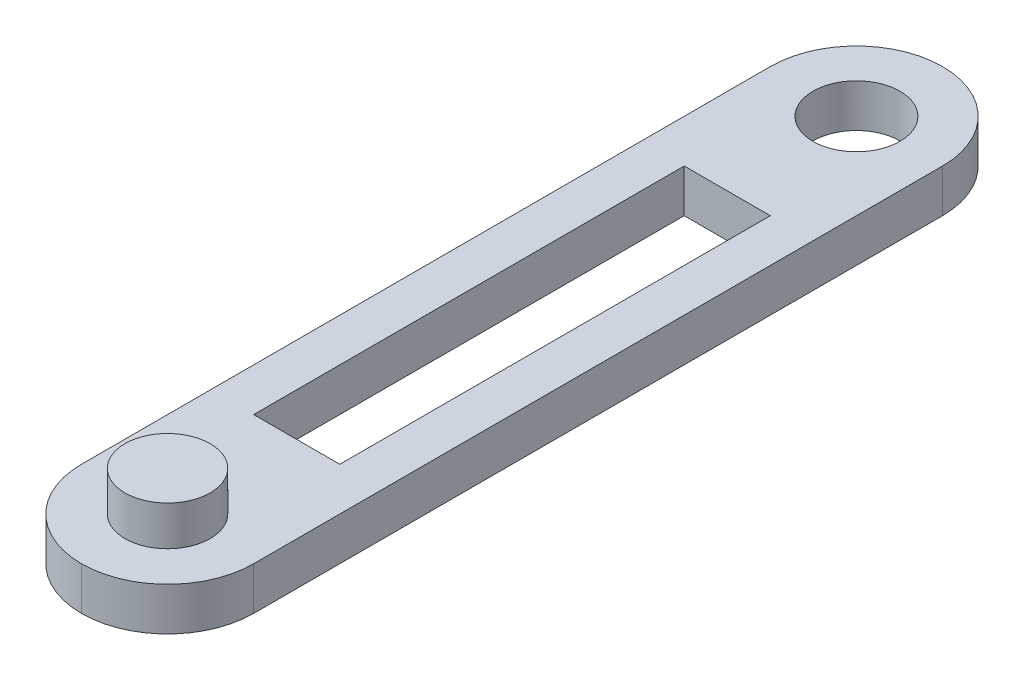
ISO-10303-21;
HEADER;
FILE_DESCRIPTION(('STEP AP214'),'2;1');
FILE_NAME('part.step','',(''),(''),'','','');
FILE_SCHEMA(('AUTOMOTIVE_DESIGN { 1 0 10303 214 1 1 1 1 }'));
ENDSEC;
DATA;
#1=APPLICATION_CONTEXT('core data for automotive mechanical design processes');
#2=APPLICATION_PROTOCOL_DEFINITION('international standard','automotive_design',2000,#1);
#3=PRODUCT_CONTEXT('',#1,'mechanical');
#4=PRODUCT('Part','Part','',(#3));
#5=PRODUCT_RELATED_PRODUCT_CATEGORY('part','',(#4));
#6=PRODUCT_DEFINITION_FORMATION('','',#4);
#7=PRODUCT_DEFINITION_CONTEXT('part definition',#1,'design');
#8=PRODUCT_DEFINITION('design','',#6,#7);
#9=PRODUCT_DEFINITION_SHAPE('','',#8);
#10=(LENGTH_UNIT() NAMED_UNIT(*) SI_UNIT(.MILLI.,.METRE.));
#11=(NAMED_UNIT(*) PLANE_ANGLE_UNIT() SI_UNIT($,.RADIAN.));
#12=(NAMED_UNIT(*) SI_UNIT($,.STERADIAN.) SOLID_ANGLE_UNIT());
#13=UNCERTAINTY_MEASURE_WITH_UNIT(LENGTH_MEASURE(1.E-05),#10,'distance_accuracy_value','');
#14=(GEOMETRIC_REPRESENTATION_CONTEXT(3) GLOBAL_UNCERTAINTY_ASSIGNED_CONTEXT((#13)) GLOBAL_UNIT_ASSIGNED_CONTEXT((#10,
#11,#12)) REPRESENTATION_CONTEXT('',''));
#15=CARTESIAN_POINT('',(0.,0.,0.));
#16=DIRECTION('',(0.,0.,1.));
#17=DIRECTION('',(1.,0.,0.));
#18=AXIS2_PLACEMENT_3D('',#15,#16,#17);
#19=CARTESIAN_POINT('',(-23.3333333333333,5.,-68.974358974359));
#20=DIRECTION('',(1.,0.,0.));
#21=DIRECTION('',(0.,0.,-1.));
#22=AXIS2_PLACEMENT_3D('',#19,#20,#21);
#23=PLANE('',#22);
#24=DIRECTION('',(0.,0.,1.));
#25=VECTOR('',#24,1.);
#26=CARTESIAN_POINT('',(-23.3333333333333,5.,-68.974358974359));
#27=LINE('',#26,#25);
#28=CARTESIAN_POINT('',(-23.3333333333333,5.,-58.974358974359));
#29=VERTEX_POINT('',#28);
#30=CARTESIAN_POINT('',(-23.3333333333333,5.,21.025641025641));
#31=VERTEX_POINT('',#30);
#32=EDGE_CURVE('E157',#29,#31,#27,.T.);
#33=ORIENTED_EDGE('',*,*,#32,.F.);
#34=DIRECTION('',(0.,-1.,0.));
#35=VECTOR('',#34,1.);
#36=CARTESIAN_POINT('',(-23.3333333333333,5.,-58.974358974359));
#37=LINE('',#36,#35);
#38=CARTESIAN_POINT('',(-23.3333333333333,0.,-58.974358974359));
#39=VERTEX_POINT('',#38);
#40=EDGE_CURVE('E173',#29,#39,#37,.T.);
#41=ORIENTED_EDGE('',*,*,#40,.T.);
#42=DIRECTION('',(0.,0.,1.));
#43=VECTOR('',#42,1.);
#44=CARTESIAN_POINT('',(-23.3333333333333,0.,-68.974358974359));
#45=LINE('',#44,#43);
#46=CARTESIAN_POINT('',(-23.3333333333333,0.,21.025641025641));
#47=VERTEX_POINT('',#46);
#48=EDGE_CURVE('E165',#39,#47,#45,.T.);
#49=ORIENTED_EDGE('',*,*,#48,.T.);
#50=DIRECTION('',(0.,-1.,0.));
#51=VECTOR('',#50,1.);
#52=CARTESIAN_POINT('',(-23.3333333333333,5.,21.025641025641));
#53=LINE('',#52,#51);
#54=EDGE_CURVE('E164',#47,#31,#53,.F.);
#55=ORIENTED_EDGE('',*,*,#54,.T.);
#56=EDGE_LOOP('',(#33,#41,#49,#55));
#57=FACE_BOUND('',#56,.T.);
#58=ADVANCED_FACE('F33',(#57),#23,.F.);
#59=CARTESIAN_POINT('',(-3.33333333333331,5.,-68.974358974359));
#60=DIRECTION('',(-1.,0.,0.));
#61=DIRECTION('',(0.,0.,1.));
#62=AXIS2_PLACEMENT_3D('',#59,#60,#61);
#63=PLANE('',#62);
#64=DIRECTION('',(0.,0.,-1.));
#65=VECTOR('',#64,1.);
#66=CARTESIAN_POINT('',(-3.33333333333331,0.,-68.974358974359));
#67=LINE('',#66,#65);
#68=CARTESIAN_POINT('',(-3.3333333333333,0.,21.025641025641));
#69=VERTEX_POINT('',#68);
#70=CARTESIAN_POINT('',(-3.33333333333331,0.,-58.974358974359));
#71=VERTEX_POINT('',#70);
#72=EDGE_CURVE('E161',#69,#71,#67,.T.);
#73=ORIENTED_EDGE('',*,*,#72,.T.);
#74=DIRECTION('',(0.,-1.,0.));
#75=VECTOR('',#74,1.);
#76=CARTESIAN_POINT('',(-3.33333333333331,5.,-58.974358974359));
#77=LINE('',#76,#75);
#78=CARTESIAN_POINT('',(-3.33333333333331,5.,-58.974358974359));
#79=VERTEX_POINT('',#78);
#80=EDGE_CURVE('E41',#71,#79,#77,.F.);
#81=ORIENTED_EDGE('',*,*,#80,.T.);
#82=DIRECTION('',(0.,0.,-1.));
#83=VECTOR('',#82,1.);
#84=CARTESIAN_POINT('',(-3.33333333333331,5.,-68.974358974359));
#85=LINE('',#84,#83);
#86=CARTESIAN_POINT('',(-3.3333333333333,5.,21.025641025641));
#87=VERTEX_POINT('',#86);
#88=EDGE_CURVE('E160',#87,#79,#85,.T.);
#89=ORIENTED_EDGE('',*,*,#88,.F.);
#90=DIRECTION('',(0.,-1.,0.));
#91=VECTOR('',#90,1.);
#92=CARTESIAN_POINT('',(-3.3333333333333,5.,21.025641025641));
#93=LINE('',#92,#91);
#94=EDGE_CURVE('E192',#87,#69,#93,.T.);
#95=ORIENTED_EDGE('',*,*,#94,.T.);
#96=EDGE_LOOP('',(#73,#81,#89,#95));
#97=FACE_BOUND('',#96,.T.);
#98=ADVANCED_FACE('F211',(#97),#63,.F.);
#99=CARTESIAN_POINT('',(0.,5.,0.));
#100=DIRECTION('',(0.,-1.,0.));
#101=DIRECTION('',(0.,0.,-1.));
#102=AXIS2_PLACEMENT_3D('',#99,#100,#101);
#103=PLANE('',#102);
#104=DIRECTION('',(0.,0.,-1.));
#105=VECTOR('',#104,1.);
#106=CARTESIAN_POINT('',(-8.3333333333333,5.,-43.974358974359));
#107=LINE('',#106,#105);
#108=CARTESIAN_POINT('',(-8.33333333333329,5.,6.02564102564103));
#109=VERTEX_POINT('',#108);
#110=CARTESIAN_POINT('',(-8.3333333333333,5.,-43.974358974359));
#111=VERTEX_POINT('',#110);
#112=EDGE_CURVE('E134',#109,#111,#107,.T.);
#113=ORIENTED_EDGE('',*,*,#112,.F.);
#114=DIRECTION('',(1.,0.,0.));
#115=VECTOR('',#114,1.);
#116=CARTESIAN_POINT('',(-18.3333333333333,5.,6.02564102564103));
#117=LINE('',#116,#115);
#118=CARTESIAN_POINT('',(-18.3333333333333,5.,6.02564102564103));
#119=VERTEX_POINT('',#118);
#120=EDGE_CURVE('E127',#119,#109,#117,.T.);
#121=ORIENTED_EDGE('',*,*,#120,.F.);
#122=DIRECTION('',(0.,0.,1.));
#123=VECTOR('',#122,1.);
#124=CARTESIAN_POINT('',(-18.3333333333333,5.,-43.974358974359));
#125=LINE('',#124,#123);
#126=CARTESIAN_POINT('',(-18.3333333333333,5.,-43.974358974359));
#127=VERTEX_POINT('',#126);
#128=EDGE_CURVE('E138',#127,#119,#125,.T.);
#129=ORIENTED_EDGE('',*,*,#128,.F.);
#130=DIRECTION('',(-1.,0.,0.));
#131=VECTOR('',#130,1.);
#132=CARTESIAN_POINT('',(-18.3333333333333,5.,-43.974358974359));
#133=LINE('',#132,#131);
#134=EDGE_CURVE('E48',#111,#127,#133,.T.);
#135=ORIENTED_EDGE('',*,*,#134,.F.);
#136=EDGE_LOOP('',(#113,#121,#129,#135));
#137=FACE_BOUND('',#136,.T.);
#138=CARTESIAN_POINT('',(-13.3333333333333,5.,-58.974358974359));
#139=DIRECTION('',(0.,1.,0.));
#140=DIRECTION('',(0.,0.,1.));
#141=AXIS2_PLACEMENT_3D('',#138,#139,#140);
#142=CIRCLE('',#141,5.05);
#143=CARTESIAN_POINT('',(-13.3333333333333,5.,-53.924358974359));
#144=VERTEX_POINT('',#143);
#145=EDGE_CURVE('E147',#144,#144,#142,.T.);
#146=ORIENTED_EDGE('',*,*,#145,.F.);
#147=EDGE_LOOP('',(#146));
#148=FACE_BOUND('',#147,.T.);
#149=CARTESIAN_POINT('',(-13.3333333333333,5.,21.025641025641));
#150=DIRECTION('',(0.,-1.,0.));
#151=DIRECTION('',(0.,0.,-1.));
#152=AXIS2_PLACEMENT_3D('',#149,#150,#151);
#153=CIRCLE('',#152,4.95);
#154=CARTESIAN_POINT('',(-13.3333333333333,5.,16.075641025641));
#155=VERTEX_POINT('',#154);
#156=EDGE_CURVE('E11',#155,#155,#153,.F.);
#157=ORIENTED_EDGE('',*,*,#156,.F.);
#158=EDGE_LOOP('',(#157));
#159=FACE_BOUND('',#158,.T.);
#160=CARTESIAN_POINT('',(-13.3333333333333,5.,-58.974358974359));
#161=DIRECTION('',(0.,-1.,0.));
#162=DIRECTION('',(0.,0.,-1.));
#163=AXIS2_PLACEMENT_3D('',#160,#161,#162);
#164=CIRCLE('',#163,10.);
#165=CARTESIAN_POINT('',(-13.3333333333333,5.,-68.974358974359));
#166=VERTEX_POINT('',#165);
#167=EDGE_CURVE('E188',#79,#166,#164,.F.);
#168=ORIENTED_EDGE('',*,*,#167,.T.);
#169=CARTESIAN_POINT('',(-13.3333333333333,5.,-58.974358974359));
#170=DIRECTION('',(0.,-1.,0.));
#171=DIRECTION('',(0.,0.,-1.));
#172=AXIS2_PLACEMENT_3D('',#169,#170,#171);
#173=CIRCLE('',#172,10.);
#174=EDGE_CURVE('E190',#166,#29,#173,.F.);
#175=ORIENTED_EDGE('',*,*,#174,.T.);
#176=ORIENTED_EDGE('',*,*,#32,.T.);
#177=CARTESIAN_POINT('',(-13.3333333333333,5.,21.025641025641));
#178=DIRECTION('',(0.,-1.,0.));
#179=DIRECTION('',(0.,0.,-1.));
#180=AXIS2_PLACEMENT_3D('',#177,#178,#179);
#181=CIRCLE('',#180,10.);
#182=CARTESIAN_POINT('',(-13.3333333333333,5.,31.025641025641));
#183=VERTEX_POINT('',#182);
#184=EDGE_CURVE('E186',#31,#183,#181,.F.);
#185=ORIENTED_EDGE('',*,*,#184,.T.);
#186=CARTESIAN_POINT('',(-13.3333333333333,5.,21.025641025641));
#187=DIRECTION('',(0.,-1.,0.));
#188=DIRECTION('',(0.,0.,-1.));
#189=AXIS2_PLACEMENT_3D('',#186,#187,#188);
#190=CIRCLE('',#189,10.);
#191=EDGE_CURVE('E184',#183,#87,#190,.F.);
#192=ORIENTED_EDGE('',*,*,#191,.T.);
#193=ORIENTED_EDGE('',*,*,#88,.T.);
#194=EDGE_LOOP('',(#168,#175,#176,#185,#192,#193));
#195=FACE_BOUND('',#194,.T.);
#196=ADVANCED_FACE('F208',(#137,#148,#159,#195),#103,.F.);
#197=CARTESIAN_POINT('',(0.,0.,0.));
#198=DIRECTION('',(0.,-1.,0.));
#199=DIRECTION('',(0.,0.,-1.));
#200=AXIS2_PLACEMENT_3D('',#197,#198,#199);
#201=PLANE('',#200);
#202=DIRECTION('',(1.,0.,0.));
#203=VECTOR('',#202,1.);
#204=CARTESIAN_POINT('',(-18.3333333333333,0.,6.02564102564103));
#205=LINE('',#204,#203);
#206=CARTESIAN_POINT('',(-18.3333333333333,0.,6.02564102564103));
#207=VERTEX_POINT('',#206);
#208=CARTESIAN_POINT('',(-8.33333333333329,0.,6.02564102564103));
#209=VERTEX_POINT('',#208);
#210=EDGE_CURVE('E124',#207,#209,#205,.T.);
#211=ORIENTED_EDGE('',*,*,#210,.T.);
#212=DIRECTION('',(0.,0.,-1.));
#213=VECTOR('',#212,1.);
#214=CARTESIAN_POINT('',(-8.3333333333333,0.,-43.974358974359));
#215=LINE('',#214,#213);
#216=CARTESIAN_POINT('',(-8.3333333333333,0.,-43.974358974359));
#217=VERTEX_POINT('',#216);
#218=EDGE_CURVE('E111',#209,#217,#215,.T.);
#219=ORIENTED_EDGE('',*,*,#218,.T.);
#220=DIRECTION('',(-1.,0.,0.));
#221=VECTOR('',#220,1.);
#222=CARTESIAN_POINT('',(-18.3333333333333,0.,-43.974358974359));
#223=LINE('',#222,#221);
#224=CARTESIAN_POINT('',(-18.3333333333333,0.,-43.974358974359));
#225=VERTEX_POINT('',#224);
#226=EDGE_CURVE('E142',#217,#225,#223,.T.);
#227=ORIENTED_EDGE('',*,*,#226,.T.);
#228=DIRECTION('',(0.,0.,1.));
#229=VECTOR('',#228,1.);
#230=CARTESIAN_POINT('',(-18.3333333333333,0.,-43.974358974359));
#231=LINE('',#230,#229);
#232=EDGE_CURVE('E132',#225,#207,#231,.T.);
#233=ORIENTED_EDGE('',*,*,#232,.T.);
#234=EDGE_LOOP('',(#211,#219,#227,#233));
#235=FACE_BOUND('',#234,.T.);
#236=CARTESIAN_POINT('',(-13.3333333333333,0.,-58.974358974359));
#237=DIRECTION('',(0.,-1.,0.));
#238=DIRECTION('',(0.,0.,-1.));
#239=AXIS2_PLACEMENT_3D('',#236,#237,#238);
#240=CIRCLE('',#239,5.05);
#241=CARTESIAN_POINT('',(-13.3333333333333,0.,-64.024358974359));
#242=VERTEX_POINT('',#241);
#243=EDGE_CURVE('E150',#242,#242,#240,.F.);
#244=ORIENTED_EDGE('',*,*,#243,.T.);
#245=EDGE_LOOP('',(#244));
#246=FACE_BOUND('',#245,.T.);
#247=ORIENTED_EDGE('',*,*,#48,.F.);
#248=CARTESIAN_POINT('',(-13.3333333333333,0.,-58.974358974359));
#249=DIRECTION('',(0.,-1.,0.));
#250=DIRECTION('',(0.,0.,-1.));
#251=AXIS2_PLACEMENT_3D('',#248,#249,#250);
#252=CIRCLE('',#251,10.);
#253=CARTESIAN_POINT('',(-13.3333333333333,0.,-68.974358974359));
#254=VERTEX_POINT('',#253);
#255=EDGE_CURVE('E182',#39,#254,#252,.T.);
#256=ORIENTED_EDGE('',*,*,#255,.T.);
#257=CARTESIAN_POINT('',(-13.3333333333333,0.,-58.974358974359));
#258=DIRECTION('',(0.,-1.,0.));
#259=DIRECTION('',(0.,0.,-1.));
#260=AXIS2_PLACEMENT_3D('',#257,#258,#259);
#261=CIRCLE('',#260,10.);
#262=EDGE_CURVE('E180',#254,#71,#261,.T.);
#263=ORIENTED_EDGE('',*,*,#262,.T.);
#264=ORIENTED_EDGE('',*,*,#72,.F.);
#265=CARTESIAN_POINT('',(-13.3333333333333,0.,21.025641025641));
#266=DIRECTION('',(0.,-1.,0.));
#267=DIRECTION('',(0.,0.,-1.));
#268=AXIS2_PLACEMENT_3D('',#265,#266,#267);
#269=CIRCLE('',#268,10.);
#270=CARTESIAN_POINT('',(-13.3333333333333,0.,31.025641025641));
#271=VERTEX_POINT('',#270);
#272=EDGE_CURVE('E176',#69,#271,#269,.T.);
#273=ORIENTED_EDGE('',*,*,#272,.T.);
#274=CARTESIAN_POINT('',(-13.3333333333333,0.,21.025641025641));
#275=DIRECTION('',(0.,-1.,0.));
#276=DIRECTION('',(0.,0.,-1.));
#277=AXIS2_PLACEMENT_3D('',#274,#275,#276);
#278=CIRCLE('',#277,10.);
#279=EDGE_CURVE('E178',#271,#47,#278,.T.);
#280=ORIENTED_EDGE('',*,*,#279,.T.);
#281=EDGE_LOOP('',(#247,#256,#263,#264,#273,#280));
#282=FACE_BOUND('',#281,.T.);
#283=ADVANCED_FACE('F130',(#235,#246,#282),#201,.T.);
#284=CARTESIAN_POINT('',(-13.3333333333333,5.,-58.974358974359));
#285=DIRECTION('',(0.,-1.,0.));
#286=DIRECTION('',(0.,0.,-1.));
#287=AXIS2_PLACEMENT_3D('',#284,#285,#286);
#288=CYLINDRICAL_SURFACE('',#287,10.);
#289=DIRECTION('',(0.,-1.,0.));
#290=VECTOR('',#289,1.);
#291=CARTESIAN_POINT('',(-13.3333333333333,5.,-68.974358974359));
#292=LINE('',#291,#290);
#293=EDGE_CURVE('E168',#166,#254,#292,.T.);
#294=ORIENTED_EDGE('',*,*,#293,.F.);
#295=ORIENTED_EDGE('',*,*,#167,.F.);
#296=ORIENTED_EDGE('',*,*,#80,.F.);
#297=ORIENTED_EDGE('',*,*,#262,.F.);
#298=EDGE_LOOP('',(#294,#295,#296,#297));
#299=FACE_BOUND('',#298,.T.);
#300=ADVANCED_FACE('F217',(#299),#288,.T.);
#301=CARTESIAN_POINT('',(-13.3333333333333,5.,-58.974358974359));
#302=DIRECTION('',(0.,-1.,0.));
#303=DIRECTION('',(0.,0.,-1.));
#304=AXIS2_PLACEMENT_3D('',#301,#302,#303);
#305=CYLINDRICAL_SURFACE('',#304,10.);
#306=ORIENTED_EDGE('',*,*,#174,.F.);
#307=ORIENTED_EDGE('',*,*,#293,.T.);
#308=ORIENTED_EDGE('',*,*,#255,.F.);
#309=ORIENTED_EDGE('',*,*,#40,.F.);
#310=EDGE_LOOP('',(#306,#307,#308,#309));
#311=FACE_BOUND('',#310,.T.);
#312=ADVANCED_FACE('F224',(#311),#305,.T.);
#313=CARTESIAN_POINT('',(-13.3333333333333,5.,21.025641025641));
#314=DIRECTION('',(0.,-1.,0.));
#315=DIRECTION('',(0.,0.,-1.));
#316=AXIS2_PLACEMENT_3D('',#313,#314,#315);
#317=CYLINDRICAL_SURFACE('',#316,10.);
#318=ORIENTED_EDGE('',*,*,#94,.F.);
#319=ORIENTED_EDGE('',*,*,#191,.F.);
#320=DIRECTION('',(0.,-1.,0.));
#321=VECTOR('',#320,1.);
#322=CARTESIAN_POINT('',(-13.3333333333333,5.,31.025641025641));
#323=LINE('',#322,#321);
#324=EDGE_CURVE('E156',#271,#183,#323,.F.);
#325=ORIENTED_EDGE('',*,*,#324,.F.);
#326=ORIENTED_EDGE('',*,*,#272,.F.);
#327=EDGE_LOOP('',(#318,#319,#325,#326));
#328=FACE_BOUND('',#327,.T.);
#329=ADVANCED_FACE('F35',(#328),#317,.T.);
#330=CARTESIAN_POINT('',(-13.3333333333333,5.,21.025641025641));
#331=DIRECTION('',(0.,-1.,0.));
#332=DIRECTION('',(0.,0.,-1.));
#333=AXIS2_PLACEMENT_3D('',#330,#331,#332);
#334=CYLINDRICAL_SURFACE('',#333,10.);
#335=ORIENTED_EDGE('',*,*,#184,.F.);
#336=ORIENTED_EDGE('',*,*,#54,.F.);
#337=ORIENTED_EDGE('',*,*,#279,.F.);
#338=ORIENTED_EDGE('',*,*,#324,.T.);
#339=EDGE_LOOP('',(#335,#336,#337,#338));
#340=FACE_BOUND('',#339,.T.);
#341=ADVANCED_FACE('F200',(#340),#334,.T.);
#342=CARTESIAN_POINT('',(-13.3333333333333,9.6,21.025641025641));
#343=DIRECTION('',(0.,-1.,0.));
#344=DIRECTION('',(0.,0.,-1.));
#345=AXIS2_PLACEMENT_3D('',#342,#343,#344);
#346=CYLINDRICAL_SURFACE('',#345,4.95);
#347=CARTESIAN_POINT('',(-13.3333333333333,9.6,21.025641025641));
#348=DIRECTION('',(0.,1.,0.));
#349=DIRECTION('',(0.,0.,1.));
#350=AXIS2_PLACEMENT_3D('',#347,#348,#349);
#351=CIRCLE('',#350,4.95);
#352=CARTESIAN_POINT('',(-13.3333333333333,9.6,25.975641025641));
#353=VERTEX_POINT('',#352);
#354=EDGE_CURVE('E153',#353,#353,#351,.T.);
#355=ORIENTED_EDGE('',*,*,#354,.F.);
#356=EDGE_LOOP('',(#355));
#357=FACE_BOUND('',#356,.T.);
#358=ORIENTED_EDGE('',*,*,#156,.T.);
#359=EDGE_LOOP('',(#358));
#360=FACE_BOUND('',#359,.T.);
#361=ADVANCED_FACE('F244',(#357,#360),#346,.T.);
#362=CARTESIAN_POINT('',(-13.3333333333333,9.6,21.025641025641));
#363=DIRECTION('',(0.,1.,0.));
#364=DIRECTION('',(0.,0.,1.));
#365=AXIS2_PLACEMENT_3D('',#362,#363,#364);
#366=PLANE('',#365);
#367=ORIENTED_EDGE('',*,*,#354,.T.);
#368=EDGE_LOOP('',(#367));
#369=FACE_BOUND('',#368,.T.);
#370=ADVANCED_FACE('F249',(#369),#366,.T.);
#371=CARTESIAN_POINT('',(-13.3333333333333,-14.2835569799683,-58.974358974359));
#372=DIRECTION('',(0.,1.,0.));
#373=DIRECTION('',(0.,0.,1.));
#374=AXIS2_PLACEMENT_3D('',#371,#372,#373);
#375=CYLINDRICAL_SURFACE('',#374,5.05);
#376=ORIENTED_EDGE('',*,*,#145,.T.);
#377=EDGE_LOOP('',(#376));
#378=FACE_BOUND('',#377,.T.);
#379=ORIENTED_EDGE('',*,*,#243,.F.);
#380=EDGE_LOOP('',(#379));
#381=FACE_BOUND('',#380,.T.);
#382=ADVANCED_FACE('F284',(#378,#381),#375,.F.);
#383=CARTESIAN_POINT('',(-18.3333333333333,-50.9901951359278,6.02564102564103));
#384=DIRECTION('',(0.,0.,1.));
#385=DIRECTION('',(1.,0.,0.));
#386=AXIS2_PLACEMENT_3D('',#383,#384,#385);
#387=PLANE('',#386);
#388=DIRECTION('',(0.,1.,0.));
#389=VECTOR('',#388,1.);
#390=CARTESIAN_POINT('',(-18.3333333333333,-50.9901951359278,6.02564102564103));
#391=LINE('',#390,#389);
#392=EDGE_CURVE('E56',#207,#119,#391,.T.);
#393=ORIENTED_EDGE('',*,*,#392,.T.);
#394=ORIENTED_EDGE('',*,*,#120,.T.);
#395=DIRECTION('',(0.,1.,0.));
#396=VECTOR('',#395,1.);
#397=CARTESIAN_POINT('',(-8.33333333333329,-50.9901951359278,6.02564102564103));
#398=LINE('',#397,#396);
#399=EDGE_CURVE('E115',#209,#109,#398,.T.);
#400=ORIENTED_EDGE('',*,*,#399,.F.);
#401=ORIENTED_EDGE('',*,*,#210,.F.);
#402=EDGE_LOOP('',(#393,#394,#400,#401));
#403=FACE_BOUND('',#402,.T.);
#404=ADVANCED_FACE('F123',(#403),#387,.F.);
#405=CARTESIAN_POINT('',(-8.3333333333333,-50.9901951359278,-43.974358974359));
#406=DIRECTION('',(1.,0.,0.));
#407=DIRECTION('',(0.,0.,-1.));
#408=AXIS2_PLACEMENT_3D('',#405,#406,#407);
#409=PLANE('',#408);
#410=ORIENTED_EDGE('',*,*,#399,.T.);
#411=ORIENTED_EDGE('',*,*,#112,.T.);
#412=DIRECTION('',(0.,1.,0.));
#413=VECTOR('',#412,1.);
#414=CARTESIAN_POINT('',(-8.3333333333333,-50.9901951359278,-43.974358974359));
#415=LINE('',#414,#413);
#416=EDGE_CURVE('E117',#217,#111,#415,.T.);
#417=ORIENTED_EDGE('',*,*,#416,.F.);
#418=ORIENTED_EDGE('',*,*,#218,.F.);
#419=EDGE_LOOP('',(#410,#411,#417,#418));
#420=FACE_BOUND('',#419,.T.);
#421=ADVANCED_FACE('F113',(#420),#409,.F.);
#422=CARTESIAN_POINT('',(-18.3333333333333,-50.9901951359278,-43.974358974359));
#423=DIRECTION('',(0.,0.,-1.));
#424=DIRECTION('',(-1.,0.,0.));
#425=AXIS2_PLACEMENT_3D('',#422,#423,#424);
#426=PLANE('',#425);
#427=ORIENTED_EDGE('',*,*,#416,.T.);
#428=ORIENTED_EDGE('',*,*,#134,.T.);
#429=DIRECTION('',(0.,1.,0.));
#430=VECTOR('',#429,1.);
#431=CARTESIAN_POINT('',(-18.3333333333333,-50.9901951359278,-43.974358974359));
#432=LINE('',#431,#430);
#433=EDGE_CURVE('E141',#225,#127,#432,.T.);
#434=ORIENTED_EDGE('',*,*,#433,.F.);
#435=ORIENTED_EDGE('',*,*,#226,.F.);
#436=EDGE_LOOP('',(#427,#428,#434,#435));
#437=FACE_BOUND('',#436,.T.);
#438=ADVANCED_FACE('F305',(#437),#426,.F.);
#439=CARTESIAN_POINT('',(-18.3333333333333,-50.9901951359278,-43.974358974359));
#440=DIRECTION('',(-1.,0.,0.));
#441=DIRECTION('',(0.,0.,1.));
#442=AXIS2_PLACEMENT_3D('',#439,#440,#441);
#443=PLANE('',#442);
#444=ORIENTED_EDGE('',*,*,#433,.T.);
#445=ORIENTED_EDGE('',*,*,#128,.T.);
#446=ORIENTED_EDGE('',*,*,#392,.F.);
#447=ORIENTED_EDGE('',*,*,#232,.F.);
#448=EDGE_LOOP('',(#444,#445,#446,#447));
#449=FACE_BOUND('',#448,.T.);
#450=ADVANCED_FACE('F314',(#449),#443,.F.);
#451=CLOSED_SHELL('',(#58,#98,#196,#283,#300,#312,#329,#341,#361,#370,#382,#404,#421,#438,#450));
#452=MANIFOLD_SOLID_BREP('B2',#451);
#453=ADVANCED_BREP_SHAPE_REPRESENTATION('',(#18,#452),#14);
#454=SHAPE_DEFINITION_REPRESENTATION(#9,#453);
ENDSEC;
END-ISO-10303-21;
